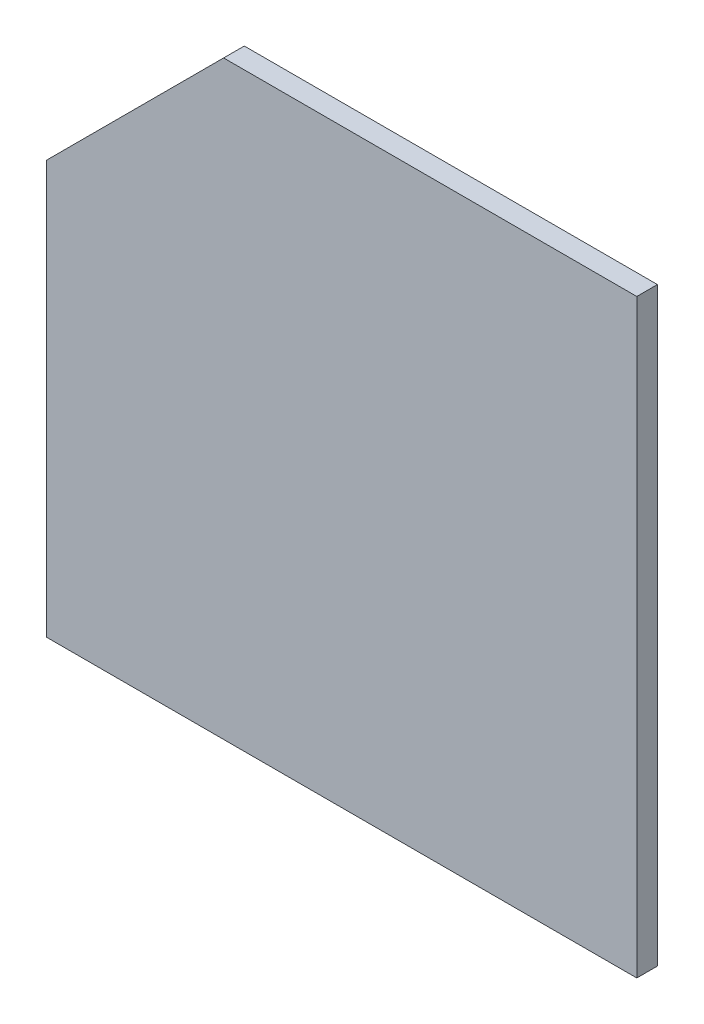
ISO-10303-21;
HEADER;
FILE_DESCRIPTION(('STEP AP214'),'2;1');
FILE_NAME('part.step','',(''),(''),'','','');
FILE_SCHEMA(('AUTOMOTIVE_DESIGN { 1 0 10303 214 1 1 1 1 }'));
ENDSEC;
DATA;
#1=APPLICATION_CONTEXT('core data for automotive mechanical design processes');
#2=APPLICATION_PROTOCOL_DEFINITION('international standard','automotive_design',2000,#1);
#3=PRODUCT_CONTEXT('',#1,'mechanical');
#4=PRODUCT('Part','Part','',(#3));
#5=PRODUCT_RELATED_PRODUCT_CATEGORY('part','',(#4));
#6=PRODUCT_DEFINITION_FORMATION('','',#4);
#7=PRODUCT_DEFINITION_CONTEXT('part definition',#1,'design');
#8=PRODUCT_DEFINITION('design','',#6,#7);
#9=PRODUCT_DEFINITION_SHAPE('','',#8);
#10=(LENGTH_UNIT() NAMED_UNIT(*) SI_UNIT(.MILLI.,.METRE.));
#11=(NAMED_UNIT(*) PLANE_ANGLE_UNIT() SI_UNIT($,.RADIAN.));
#12=(NAMED_UNIT(*) SI_UNIT($,.STERADIAN.) SOLID_ANGLE_UNIT());
#13=UNCERTAINTY_MEASURE_WITH_UNIT(LENGTH_MEASURE(1.E-05),#10,'distance_accuracy_value','');
#14=(GEOMETRIC_REPRESENTATION_CONTEXT(3) GLOBAL_UNCERTAINTY_ASSIGNED_CONTEXT((#13)) GLOBAL_UNIT_ASSIGNED_CONTEXT((#10,
#11,#12)) REPRESENTATION_CONTEXT('',''));
#15=CARTESIAN_POINT('',(0.,0.,0.));
#16=DIRECTION('',(0.,0.,1.));
#17=DIRECTION('',(1.,0.,0.));
#18=AXIS2_PLACEMENT_3D('',#15,#16,#17);
#19=CARTESIAN_POINT('',(2.27,11.28,-1.07));
#20=DIRECTION('',(1.,0.,0.));
#21=DIRECTION('',(0.,1.,0.));
#22=AXIS2_PLACEMENT_3D('',#19,#20,#21);
#23=PLANE('',#22);
#24=DIRECTION('',(0.,1.,0.));
#25=VECTOR('',#24,1.);
#26=CARTESIAN_POINT('',(2.27,11.28,-1.035));
#27=LINE('',#26,#25);
#28=CARTESIAN_POINT('',(2.27,10.28,-1.035));
#29=VERTEX_POINT('',#28);
#30=CARTESIAN_POINT('',(2.27,11.28,-1.035));
#31=VERTEX_POINT('',#30);
#32=EDGE_CURVE('E11',#29,#31,#27,.T.);
#33=ORIENTED_EDGE('',*,*,#32,.F.);
#34=DIRECTION('',(0.,0.,1.));
#35=VECTOR('',#34,1.);
#36=CARTESIAN_POINT('',(2.27,10.28,-1.07));
#37=LINE('',#36,#35);
#38=CARTESIAN_POINT('',(2.27,10.28,-1.07));
#39=VERTEX_POINT('',#38);
#40=EDGE_CURVE('E24',#39,#29,#37,.T.);
#41=ORIENTED_EDGE('',*,*,#40,.F.);
#42=DIRECTION('',(0.,1.,0.));
#43=VECTOR('',#42,1.);
#44=CARTESIAN_POINT('',(2.27,11.28,-1.07));
#45=LINE('',#44,#43);
#46=CARTESIAN_POINT('',(2.27,11.28,-1.07));
#47=VERTEX_POINT('',#46);
#48=EDGE_CURVE('E104',#39,#47,#45,.T.);
#49=ORIENTED_EDGE('',*,*,#48,.T.);
#50=DIRECTION('',(0.,0.,1.));
#51=VECTOR('',#50,1.);
#52=CARTESIAN_POINT('',(2.27,11.28,-1.07));
#53=LINE('',#52,#51);
#54=EDGE_CURVE('E84',#47,#31,#53,.T.);
#55=ORIENTED_EDGE('',*,*,#54,.T.);
#56=EDGE_LOOP('',(#33,#41,#49,#55));
#57=FACE_BOUND('',#56,.T.);
#58=ADVANCED_FACE('F17',(#57),#23,.T.);
#59=CARTESIAN_POINT('',(2.27,10.28,-1.07));
#60=DIRECTION('',(0.,-1.,0.));
#61=DIRECTION('',(0.,0.,-1.));
#62=AXIS2_PLACEMENT_3D('',#59,#60,#61);
#63=PLANE('',#62);
#64=DIRECTION('',(1.,0.,0.));
#65=VECTOR('',#64,1.);
#66=CARTESIAN_POINT('',(2.27,10.28,-1.035));
#67=LINE('',#66,#65);
#68=CARTESIAN_POINT('',(1.27,10.28,-1.035));
#69=VERTEX_POINT('',#68);
#70=EDGE_CURVE('E101',#69,#29,#67,.T.);
#71=ORIENTED_EDGE('',*,*,#70,.F.);
#72=DIRECTION('',(0.,0.,1.));
#73=VECTOR('',#72,1.);
#74=CARTESIAN_POINT('',(1.27,10.28,-1.07));
#75=LINE('',#74,#73);
#76=CARTESIAN_POINT('',(1.27,10.28,-1.07));
#77=VERTEX_POINT('',#76);
#78=EDGE_CURVE('E98',#77,#69,#75,.T.);
#79=ORIENTED_EDGE('',*,*,#78,.F.);
#80=DIRECTION('',(1.,0.,0.));
#81=VECTOR('',#80,1.);
#82=CARTESIAN_POINT('',(2.27,10.28,-1.07));
#83=LINE('',#82,#81);
#84=EDGE_CURVE('E95',#77,#39,#83,.T.);
#85=ORIENTED_EDGE('',*,*,#84,.T.);
#86=ORIENTED_EDGE('',*,*,#40,.T.);
#87=EDGE_LOOP('',(#71,#79,#85,#86));
#88=FACE_BOUND('',#87,.T.);
#89=ADVANCED_FACE('F106',(#88),#63,.T.);
#90=CARTESIAN_POINT('',(1.27,10.28,-1.07));
#91=DIRECTION('',(-1.,0.,0.));
#92=DIRECTION('',(0.,0.,1.));
#93=AXIS2_PLACEMENT_3D('',#90,#91,#92);
#94=PLANE('',#93);
#95=DIRECTION('',(0.,-1.,0.));
#96=VECTOR('',#95,1.);
#97=CARTESIAN_POINT('',(1.27,10.28,-1.035));
#98=LINE('',#97,#96);
#99=CARTESIAN_POINT('',(1.27,10.98,-1.035));
#100=VERTEX_POINT('',#99);
#101=EDGE_CURVE('E92',#100,#69,#98,.T.);
#102=ORIENTED_EDGE('',*,*,#101,.F.);
#103=DIRECTION('',(0.,0.,1.));
#104=VECTOR('',#103,1.);
#105=CARTESIAN_POINT('',(1.27,10.98,-1.07));
#106=LINE('',#105,#104);
#107=CARTESIAN_POINT('',(1.27,10.98,-1.07));
#108=VERTEX_POINT('',#107);
#109=EDGE_CURVE('E90',#108,#100,#106,.T.);
#110=ORIENTED_EDGE('',*,*,#109,.F.);
#111=DIRECTION('',(0.,-1.,0.));
#112=VECTOR('',#111,1.);
#113=CARTESIAN_POINT('',(1.27,10.28,-1.07));
#114=LINE('',#113,#112);
#115=EDGE_CURVE('E79',#108,#77,#114,.T.);
#116=ORIENTED_EDGE('',*,*,#115,.T.);
#117=ORIENTED_EDGE('',*,*,#78,.T.);
#118=EDGE_LOOP('',(#102,#110,#116,#117));
#119=FACE_BOUND('',#118,.T.);
#120=ADVANCED_FACE('F109',(#119),#94,.T.);
#121=CARTESIAN_POINT('',(1.27,10.98,-1.07));
#122=DIRECTION('',(-0.707106781186548,0.707106781186548,0.));
#123=DIRECTION('',(0.,0.,1.));
#124=AXIS2_PLACEMENT_3D('',#121,#122,#123);
#125=PLANE('',#124);
#126=DIRECTION('',(-0.707106781186548,-0.707106781186548,0.));
#127=VECTOR('',#126,1.);
#128=CARTESIAN_POINT('',(1.27,10.98,-1.035));
#129=LINE('',#128,#127);
#130=CARTESIAN_POINT('',(1.57,11.28,-1.035));
#131=VERTEX_POINT('',#130);
#132=EDGE_CURVE('E66',#131,#100,#129,.T.);
#133=ORIENTED_EDGE('',*,*,#132,.F.);
#134=DIRECTION('',(0.,0.,1.));
#135=VECTOR('',#134,1.);
#136=CARTESIAN_POINT('',(1.57,11.28,-1.07));
#137=LINE('',#136,#135);
#138=CARTESIAN_POINT('',(1.57,11.28,-1.07));
#139=VERTEX_POINT('',#138);
#140=EDGE_CURVE('E60',#139,#131,#137,.T.);
#141=ORIENTED_EDGE('',*,*,#140,.F.);
#142=DIRECTION('',(-0.707106781186548,-0.707106781186548,0.));
#143=VECTOR('',#142,1.);
#144=CARTESIAN_POINT('',(1.27,10.98,-1.07));
#145=LINE('',#144,#143);
#146=EDGE_CURVE('E64',#139,#108,#145,.T.);
#147=ORIENTED_EDGE('',*,*,#146,.T.);
#148=ORIENTED_EDGE('',*,*,#109,.T.);
#149=EDGE_LOOP('',(#133,#141,#147,#148));
#150=FACE_BOUND('',#149,.T.);
#151=ADVANCED_FACE('F62',(#150),#125,.T.);
#152=CARTESIAN_POINT('',(1.57,11.28,-1.07));
#153=DIRECTION('',(0.,1.,0.));
#154=DIRECTION('',(1.,0.,0.));
#155=AXIS2_PLACEMENT_3D('',#152,#153,#154);
#156=PLANE('',#155);
#157=DIRECTION('',(-1.,0.,0.));
#158=VECTOR('',#157,1.);
#159=CARTESIAN_POINT('',(1.57,11.28,-1.035));
#160=LINE('',#159,#158);
#161=EDGE_CURVE('E80',#31,#131,#160,.T.);
#162=ORIENTED_EDGE('',*,*,#161,.F.);
#163=ORIENTED_EDGE('',*,*,#54,.F.);
#164=DIRECTION('',(-1.,0.,0.));
#165=VECTOR('',#164,1.);
#166=CARTESIAN_POINT('',(1.57,11.28,-1.07));
#167=LINE('',#166,#165);
#168=EDGE_CURVE('E76',#47,#139,#167,.T.);
#169=ORIENTED_EDGE('',*,*,#168,.T.);
#170=ORIENTED_EDGE('',*,*,#140,.T.);
#171=EDGE_LOOP('',(#162,#163,#169,#170));
#172=FACE_BOUND('',#171,.T.);
#173=ADVANCED_FACE('F83',(#172),#156,.T.);
#174=CARTESIAN_POINT('',(0.,0.,-1.07));
#175=DIRECTION('',(0.,0.,-1.));
#176=DIRECTION('',(0.,-1.,0.));
#177=AXIS2_PLACEMENT_3D('',#174,#175,#176);
#178=PLANE('',#177);
#179=ORIENTED_EDGE('',*,*,#48,.F.);
#180=ORIENTED_EDGE('',*,*,#84,.F.);
#181=ORIENTED_EDGE('',*,*,#115,.F.);
#182=ORIENTED_EDGE('',*,*,#146,.F.);
#183=ORIENTED_EDGE('',*,*,#168,.F.);
#184=EDGE_LOOP('',(#179,#180,#181,#182,#183));
#185=FACE_BOUND('',#184,.T.);
#186=ADVANCED_FACE('F75',(#185),#178,.T.);
#187=CARTESIAN_POINT('',(0.,0.,-1.035));
#188=DIRECTION('',(0.,0.,-1.));
#189=DIRECTION('',(0.,-1.,0.));
#190=AXIS2_PLACEMENT_3D('',#187,#188,#189);
#191=PLANE('',#190);
#192=ORIENTED_EDGE('',*,*,#32,.T.);
#193=ORIENTED_EDGE('',*,*,#161,.T.);
#194=ORIENTED_EDGE('',*,*,#132,.T.);
#195=ORIENTED_EDGE('',*,*,#101,.T.);
#196=ORIENTED_EDGE('',*,*,#70,.T.);
#197=EDGE_LOOP('',(#192,#193,#194,#195,#196));
#198=FACE_BOUND('',#197,.T.);
#199=ADVANCED_FACE('F107',(#198),#191,.F.);
#200=CLOSED_SHELL('',(#58,#89,#120,#151,#173,#186,#199));
#201=MANIFOLD_SOLID_BREP('B1',#200);
#202=ADVANCED_BREP_SHAPE_REPRESENTATION('',(#18,#201),#14);
#203=SHAPE_DEFINITION_REPRESENTATION(#9,#202);
ENDSEC;
END-ISO-10303-21;
